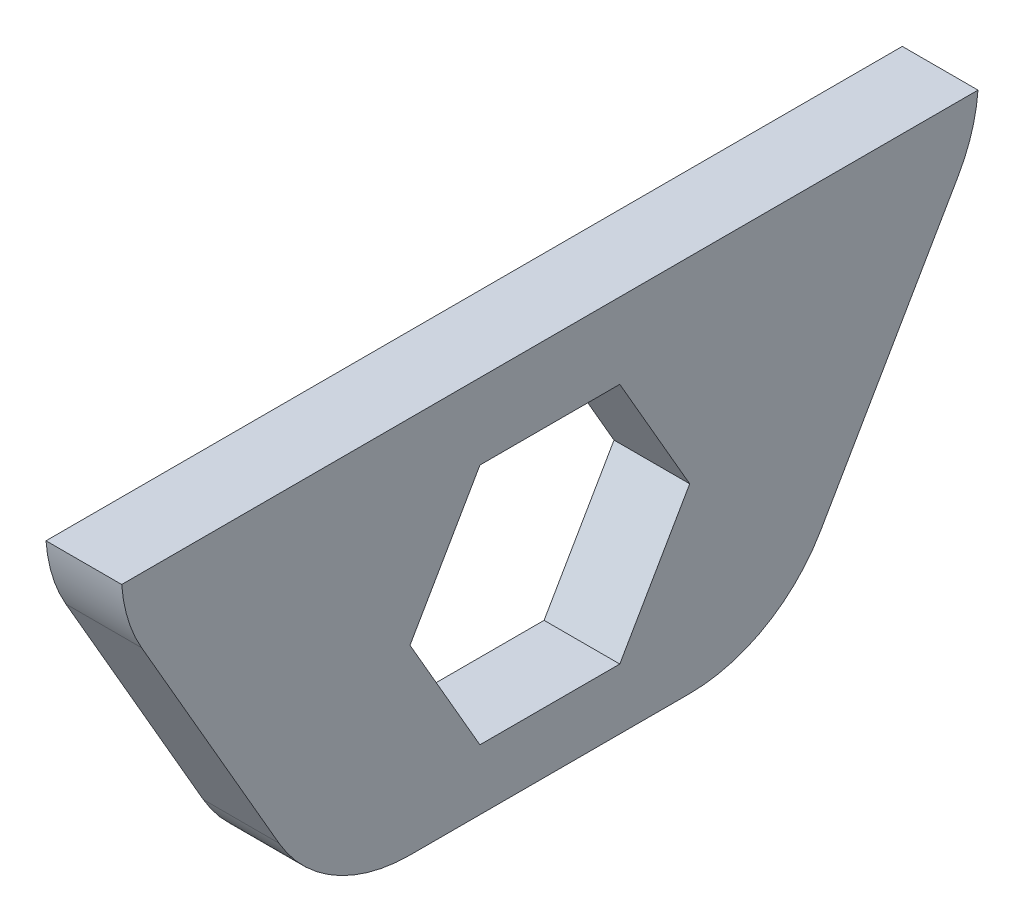
ISO-10303-21;
HEADER;
FILE_DESCRIPTION(('STEP AP214'),'2;1');
FILE_NAME('part.step','',(''),(''),'','','');
FILE_SCHEMA(('AUTOMOTIVE_DESIGN { 1 0 10303 214 1 1 1 1 }'));
ENDSEC;
DATA;
#1=APPLICATION_CONTEXT('core data for automotive mechanical design processes');
#2=APPLICATION_PROTOCOL_DEFINITION('international standard','automotive_design',2000,#1);
#3=PRODUCT_CONTEXT('',#1,'mechanical');
#4=PRODUCT('Part','Part','',(#3));
#5=PRODUCT_RELATED_PRODUCT_CATEGORY('part','',(#4));
#6=PRODUCT_DEFINITION_FORMATION('','',#4);
#7=PRODUCT_DEFINITION_CONTEXT('part definition',#1,'design');
#8=PRODUCT_DEFINITION('design','',#6,#7);
#9=PRODUCT_DEFINITION_SHAPE('','',#8);
#10=(LENGTH_UNIT() NAMED_UNIT(*) SI_UNIT(.MILLI.,.METRE.));
#11=(NAMED_UNIT(*) PLANE_ANGLE_UNIT() SI_UNIT($,.RADIAN.));
#12=(NAMED_UNIT(*) SI_UNIT($,.STERADIAN.) SOLID_ANGLE_UNIT());
#13=UNCERTAINTY_MEASURE_WITH_UNIT(LENGTH_MEASURE(1.E-05),#10,'distance_accuracy_value','');
#14=(GEOMETRIC_REPRESENTATION_CONTEXT(3) GLOBAL_UNCERTAINTY_ASSIGNED_CONTEXT((#13)) GLOBAL_UNIT_ASSIGNED_CONTEXT((#10,
#11,#12)) REPRESENTATION_CONTEXT('',''));
#15=CARTESIAN_POINT('',(0.,0.,0.));
#16=DIRECTION('',(0.,0.,1.));
#17=DIRECTION('',(1.,0.,0.));
#18=AXIS2_PLACEMENT_3D('',#15,#16,#17);
#19=CARTESIAN_POINT('',(5.,0.,-30.));
#20=DIRECTION('',(0.,1.,0.));
#21=DIRECTION('',(0.,0.,1.));
#22=AXIS2_PLACEMENT_3D('',#19,#20,#21);
#23=PLANE('',#22);
#24=DIRECTION('',(0.,0.,-1.));
#25=VECTOR('',#24,1.);
#26=CARTESIAN_POINT('',(0.,0.,-30.));
#27=LINE('',#26,#25);
#28=CARTESIAN_POINT('',(0.,0.,-5.77350269189627));
#29=VERTEX_POINT('',#28);
#30=CARTESIAN_POINT('',(0.,0.,-24.2264973081037));
#31=VERTEX_POINT('',#30);
#32=EDGE_CURVE('E170',#29,#31,#27,.T.);
#33=ORIENTED_EDGE('',*,*,#32,.T.);
#34=DIRECTION('',(-1.,0.,0.));
#35=VECTOR('',#34,1.);
#36=CARTESIAN_POINT('',(5.,0.,-24.2264973081037));
#37=LINE('',#36,#35);
#38=CARTESIAN_POINT('',(5.,0.,-24.2264973081037));
#39=VERTEX_POINT('',#38);
#40=EDGE_CURVE('E229',#31,#39,#37,.F.);
#41=ORIENTED_EDGE('',*,*,#40,.T.);
#42=DIRECTION('',(0.,0.,-1.));
#43=VECTOR('',#42,1.);
#44=CARTESIAN_POINT('',(5.,0.,-30.));
#45=LINE('',#44,#43);
#46=CARTESIAN_POINT('',(5.,0.,-5.77350269189627));
#47=VERTEX_POINT('',#46);
#48=EDGE_CURVE('E177',#47,#39,#45,.T.);
#49=ORIENTED_EDGE('',*,*,#48,.F.);
#50=DIRECTION('',(-1.,0.,0.));
#51=VECTOR('',#50,1.);
#52=CARTESIAN_POINT('',(5.,0.,-5.77350269189627));
#53=LINE('',#52,#51);
#54=EDGE_CURVE('E226',#47,#29,#53,.T.);
#55=ORIENTED_EDGE('',*,*,#54,.T.);
#56=EDGE_LOOP('',(#33,#41,#49,#55));
#57=FACE_BOUND('',#56,.T.);
#58=ADVANCED_FACE('F36',(#57),#23,.F.);
#59=CARTESIAN_POINT('',(5.,23.,-43.2790561913613));
#60=DIRECTION('',(0.,0.499999999999998,0.86602540378444));
#61=DIRECTION('',(0.,-0.86602540378444,0.499999999999998));
#62=AXIS2_PLACEMENT_3D('',#59,#60,#61);
#63=PLANE('',#62);
#64=DIRECTION('',(0.,0.86602540378444,-0.499999999999998));
#65=VECTOR('',#64,1.);
#66=CARTESIAN_POINT('',(0.,23.,-43.2790561913613));
#67=LINE('',#66,#65);
#68=CARTESIAN_POINT('',(0.,5.00000000000002,-32.8867513459481));
#69=VERTEX_POINT('',#68);
#70=CARTESIAN_POINT('',(0.,20.7250827823646,-41.9656321233754));
#71=VERTEX_POINT('',#70);
#72=EDGE_CURVE('E192',#69,#71,#67,.T.);
#73=ORIENTED_EDGE('',*,*,#72,.T.);
#74=DIRECTION('',(1.,0.,0.));
#75=VECTOR('',#74,1.);
#76=CARTESIAN_POINT('',(5.,20.7250827823646,-41.9656321233754));
#77=LINE('',#76,#75);
#78=CARTESIAN_POINT('',(5.,20.7250827823646,-41.9656321233754));
#79=VERTEX_POINT('',#78);
#80=EDGE_CURVE('E216',#71,#79,#77,.T.);
#81=ORIENTED_EDGE('',*,*,#80,.T.);
#82=DIRECTION('',(0.,0.86602540378444,-0.499999999999998));
#83=VECTOR('',#82,1.);
#84=CARTESIAN_POINT('',(5.,23.,-43.2790561913613));
#85=LINE('',#84,#83);
#86=CARTESIAN_POINT('',(5.,5.00000000000002,-32.8867513459481));
#87=VERTEX_POINT('',#86);
#88=EDGE_CURVE('E180',#87,#79,#85,.T.);
#89=ORIENTED_EDGE('',*,*,#88,.F.);
#90=DIRECTION('',(-1.,0.,0.));
#91=VECTOR('',#90,1.);
#92=CARTESIAN_POINT('',(5.,5.00000000000002,-32.8867513459481));
#93=LINE('',#92,#91);
#94=EDGE_CURVE('E213',#87,#69,#93,.T.);
#95=ORIENTED_EDGE('',*,*,#94,.T.);
#96=EDGE_LOOP('',(#73,#81,#89,#95));
#97=FACE_BOUND('',#96,.T.);
#98=ADVANCED_FACE('F271',(#97),#63,.F.);
#99=CARTESIAN_POINT('',(5.,25.,-43.2790561913613));
#100=DIRECTION('',(0.,-1.,0.));
#101=DIRECTION('',(0.,0.,-1.));
#102=AXIS2_PLACEMENT_3D('',#99,#100,#101);
#103=PLANE('',#102);
#104=DIRECTION('',(0.,0.,1.));
#105=VECTOR('',#104,1.);
#106=CARTESIAN_POINT('',(0.,25.,-43.2790561913613));
#107=LINE('',#106,#105);
#108=CARTESIAN_POINT('',(0.,25.,-43.2790561913613));
#109=VERTEX_POINT('',#108);
#110=CARTESIAN_POINT('',(0.,25.,13.2790561913613));
#111=VERTEX_POINT('',#110);
#112=EDGE_CURVE('E195',#109,#111,#107,.T.);
#113=ORIENTED_EDGE('',*,*,#112,.T.);
#114=DIRECTION('',(-1.,0.,0.));
#115=VECTOR('',#114,1.);
#116=CARTESIAN_POINT('',(5.,25.,13.2790561913613));
#117=LINE('',#116,#115);
#118=CARTESIAN_POINT('',(5.,25.,13.2790561913613));
#119=VERTEX_POINT('',#118);
#120=EDGE_CURVE('E189',#119,#111,#117,.T.);
#121=ORIENTED_EDGE('',*,*,#120,.F.);
#122=DIRECTION('',(0.,0.,1.));
#123=VECTOR('',#122,1.);
#124=CARTESIAN_POINT('',(5.,25.,-43.2790561913613));
#125=LINE('',#124,#123);
#126=CARTESIAN_POINT('',(5.,25.,-43.2790561913613));
#127=VERTEX_POINT('',#126);
#128=EDGE_CURVE('E184',#127,#119,#125,.T.);
#129=ORIENTED_EDGE('',*,*,#128,.F.);
#130=DIRECTION('',(-1.,0.,0.));
#131=VECTOR('',#130,1.);
#132=CARTESIAN_POINT('',(5.,25.,-43.2790561913613));
#133=LINE('',#132,#131);
#134=EDGE_CURVE('E202',#127,#109,#133,.T.);
#135=ORIENTED_EDGE('',*,*,#134,.T.);
#136=EDGE_LOOP('',(#113,#121,#129,#135));
#137=FACE_BOUND('',#136,.T.);
#138=ADVANCED_FACE('F277',(#137),#103,.F.);
#139=CARTESIAN_POINT('',(5.,0.,0.));
#140=DIRECTION('',(0.,0.499999999999998,-0.86602540378444));
#141=DIRECTION('',(0.,0.86602540378444,0.499999999999998));
#142=AXIS2_PLACEMENT_3D('',#139,#140,#141);
#143=PLANE('',#142);
#144=DIRECTION('',(0.,-0.86602540378444,-0.499999999999998));
#145=VECTOR('',#144,1.);
#146=CARTESIAN_POINT('',(0.,0.,0.));
#147=LINE('',#146,#145);
#148=CARTESIAN_POINT('',(0.,20.7250827823646,11.9656321233754));
#149=VERTEX_POINT('',#148);
#150=CARTESIAN_POINT('',(0.,5.00000000000002,2.88675134594812));
#151=VERTEX_POINT('',#150);
#152=EDGE_CURVE('E181',#149,#151,#147,.T.);
#153=ORIENTED_EDGE('',*,*,#152,.T.);
#154=DIRECTION('',(-1.,0.,0.));
#155=VECTOR('',#154,1.);
#156=CARTESIAN_POINT('',(5.,5.00000000000002,2.88675134594813));
#157=LINE('',#156,#155);
#158=CARTESIAN_POINT('',(5.,5.00000000000002,2.88675134594812));
#159=VERTEX_POINT('',#158);
#160=EDGE_CURVE('E234',#151,#159,#157,.F.);
#161=ORIENTED_EDGE('',*,*,#160,.T.);
#162=DIRECTION('',(0.,-0.86602540378444,-0.499999999999998));
#163=VECTOR('',#162,1.);
#164=CARTESIAN_POINT('',(5.,0.,0.));
#165=LINE('',#164,#163);
#166=CARTESIAN_POINT('',(5.,20.7250827823646,11.9656321233754));
#167=VERTEX_POINT('',#166);
#168=EDGE_CURVE('E186',#167,#159,#165,.T.);
#169=ORIENTED_EDGE('',*,*,#168,.F.);
#170=DIRECTION('',(-1.,0.,0.));
#171=VECTOR('',#170,1.);
#172=CARTESIAN_POINT('',(5.,20.7250827823646,11.9656321233754));
#173=LINE('',#172,#171);
#174=EDGE_CURVE('E231',#167,#149,#173,.T.);
#175=ORIENTED_EDGE('',*,*,#174,.T.);
#176=EDGE_LOOP('',(#153,#161,#169,#175));
#177=FACE_BOUND('',#176,.T.);
#178=ADVANCED_FACE('F314',(#177),#143,.F.);
#179=CARTESIAN_POINT('',(5.,0.,0.));
#180=DIRECTION('',(1.,0.,0.));
#181=DIRECTION('',(0.,0.,-1.));
#182=AXIS2_PLACEMENT_3D('',#179,#180,#181);
#183=PLANE('',#182);
#184=DIRECTION('',(0.,0.866025403784439,0.5));
#185=VECTOR('',#184,1.);
#186=CARTESIAN_POINT('',(5.,12.,-24.237604307034));
#187=LINE('',#186,#185);
#188=CARTESIAN_POINT('',(5.,12.,-24.237604307034));
#189=VERTEX_POINT('',#188);
#190=CARTESIAN_POINT('',(5.,20.,-19.618802153517));
#191=VERTEX_POINT('',#190);
#192=EDGE_CURVE('E51',#189,#191,#187,.T.);
#193=ORIENTED_EDGE('',*,*,#192,.F.);
#194=DIRECTION('',(0.,0.866025403784438,-0.5));
#195=VECTOR('',#194,1.);
#196=CARTESIAN_POINT('',(5.,4.,-19.618802153517));
#197=LINE('',#196,#195);
#198=CARTESIAN_POINT('',(5.,4.,-19.618802153517));
#199=VERTEX_POINT('',#198);
#200=EDGE_CURVE('E165',#199,#189,#197,.T.);
#201=ORIENTED_EDGE('',*,*,#200,.F.);
#202=DIRECTION('',(0.,0.,-1.));
#203=VECTOR('',#202,1.);
#204=CARTESIAN_POINT('',(5.,4.,-10.381197846483));
#205=LINE('',#204,#203);
#206=CARTESIAN_POINT('',(5.,4.,-10.381197846483));
#207=VERTEX_POINT('',#206);
#208=EDGE_CURVE('E159',#207,#199,#205,.T.);
#209=ORIENTED_EDGE('',*,*,#208,.F.);
#210=DIRECTION('',(0.,-0.866025403784439,-0.5));
#211=VECTOR('',#210,1.);
#212=CARTESIAN_POINT('',(5.,12.,-5.76239569296598));
#213=LINE('',#212,#211);
#214=CARTESIAN_POINT('',(5.,12.,-5.76239569296598));
#215=VERTEX_POINT('',#214);
#216=EDGE_CURVE('E157',#215,#207,#213,.T.);
#217=ORIENTED_EDGE('',*,*,#216,.F.);
#218=DIRECTION('',(0.,-0.866025403784439,0.5));
#219=VECTOR('',#218,1.);
#220=CARTESIAN_POINT('',(5.,20.,-10.381197846483));
#221=LINE('',#220,#219);
#222=CARTESIAN_POINT('',(5.,20.,-10.381197846483));
#223=VERTEX_POINT('',#222);
#224=EDGE_CURVE('E140',#223,#215,#221,.T.);
#225=ORIENTED_EDGE('',*,*,#224,.F.);
#226=DIRECTION('',(0.,0.,1.));
#227=VECTOR('',#226,1.);
#228=CARTESIAN_POINT('',(5.,20.,-19.618802153517));
#229=LINE('',#228,#227);
#230=EDGE_CURVE('E149',#191,#223,#229,.T.);
#231=ORIENTED_EDGE('',*,*,#230,.F.);
#232=EDGE_LOOP('',(#193,#201,#209,#217,#225,#231));
#233=FACE_BOUND('',#232,.T.);
#234=ORIENTED_EDGE('',*,*,#88,.T.);
#235=CARTESIAN_POINT('',(5.,25.7250827823646,-33.305378085531));
#236=DIRECTION('',(1.,0.,0.));
#237=DIRECTION('',(0.,0.,-1.));
#238=AXIS2_PLACEMENT_3D('',#235,#236,#237);
#239=CIRCLE('',#238,10.);
#240=EDGE_CURVE('E224',#79,#127,#239,.T.);
#241=ORIENTED_EDGE('',*,*,#240,.T.);
#242=ORIENTED_EDGE('',*,*,#128,.T.);
#243=CARTESIAN_POINT('',(5.,25.7250827823646,3.30537808553104));
#244=DIRECTION('',(1.,0.,0.));
#245=DIRECTION('',(0.,0.,-1.));
#246=AXIS2_PLACEMENT_3D('',#243,#244,#245);
#247=CIRCLE('',#246,10.);
#248=EDGE_CURVE('E218',#119,#167,#247,.T.);
#249=ORIENTED_EDGE('',*,*,#248,.T.);
#250=ORIENTED_EDGE('',*,*,#168,.T.);
#251=CARTESIAN_POINT('',(5.,10.,-5.77350269189627));
#252=DIRECTION('',(1.,0.,0.));
#253=DIRECTION('',(0.,0.,-1.));
#254=AXIS2_PLACEMENT_3D('',#251,#252,#253);
#255=CIRCLE('',#254,10.);
#256=EDGE_CURVE('E220',#159,#47,#255,.T.);
#257=ORIENTED_EDGE('',*,*,#256,.T.);
#258=ORIENTED_EDGE('',*,*,#48,.T.);
#259=CARTESIAN_POINT('',(5.,10.,-24.2264973081037));
#260=DIRECTION('',(1.,0.,0.));
#261=DIRECTION('',(0.,0.,-1.));
#262=AXIS2_PLACEMENT_3D('',#259,#260,#261);
#263=CIRCLE('',#262,10.);
#264=EDGE_CURVE('E222',#39,#87,#263,.T.);
#265=ORIENTED_EDGE('',*,*,#264,.T.);
#266=EDGE_LOOP('',(#234,#241,#242,#249,#250,#257,#258,#265));
#267=FACE_BOUND('',#266,.T.);
#268=ADVANCED_FACE('F153',(#233,#267),#183,.T.);
#269=CARTESIAN_POINT('',(0.,0.,0.));
#270=DIRECTION('',(1.,0.,0.));
#271=DIRECTION('',(0.,0.,-1.));
#272=AXIS2_PLACEMENT_3D('',#269,#270,#271);
#273=PLANE('',#272);
#274=DIRECTION('',(0.,0.866025403784438,-0.5));
#275=VECTOR('',#274,1.);
#276=CARTESIAN_POINT('',(0.,-7.49519052838329,-12.9820508075689));
#277=LINE('',#276,#275);
#278=CARTESIAN_POINT('',(0.,4.,-19.618802153517));
#279=VERTEX_POINT('',#278);
#280=CARTESIAN_POINT('',(0.,12.,-24.237604307034));
#281=VERTEX_POINT('',#280);
#282=EDGE_CURVE('E44',#279,#281,#277,.T.);
#283=ORIENTED_EDGE('',*,*,#282,.T.);
#284=DIRECTION('',(0.,0.866025403784439,0.5));
#285=VECTOR('',#284,1.);
#286=CARTESIAN_POINT('',(0.,13.4951905283833,-23.3743556529821));
#287=LINE('',#286,#285);
#288=CARTESIAN_POINT('',(0.,20.,-19.618802153517));
#289=VERTEX_POINT('',#288);
#290=EDGE_CURVE('E11',#281,#289,#287,.T.);
#291=ORIENTED_EDGE('',*,*,#290,.T.);
#292=DIRECTION('',(0.,0.,1.));
#293=VECTOR('',#292,1.);
#294=CARTESIAN_POINT('',(0.,20.,0.));
#295=LINE('',#294,#293);
#296=CARTESIAN_POINT('',(0.,20.,-10.381197846483));
#297=VERTEX_POINT('',#296);
#298=EDGE_CURVE('E236',#289,#297,#295,.T.);
#299=ORIENTED_EDGE('',*,*,#298,.T.);
#300=DIRECTION('',(0.,-0.866025403784439,0.5));
#301=VECTOR('',#300,1.);
#302=CARTESIAN_POINT('',(0.,0.504809471616711,0.874355652982143));
#303=LINE('',#302,#301);
#304=CARTESIAN_POINT('',(0.,12.,-5.76239569296598));
#305=VERTEX_POINT('',#304);
#306=EDGE_CURVE('E143',#297,#305,#303,.T.);
#307=ORIENTED_EDGE('',*,*,#306,.T.);
#308=DIRECTION('',(0.,-0.866025403784439,-0.5));
#309=VECTOR('',#308,1.);
#310=CARTESIAN_POINT('',(0.,5.49519052838329,-9.51794919243112));
#311=LINE('',#310,#309);
#312=CARTESIAN_POINT('',(0.,4.,-10.381197846483));
#313=VERTEX_POINT('',#312);
#314=EDGE_CURVE('E239',#305,#313,#311,.T.);
#315=ORIENTED_EDGE('',*,*,#314,.T.);
#316=DIRECTION('',(0.,0.,-1.));
#317=VECTOR('',#316,1.);
#318=CARTESIAN_POINT('',(0.,4.,0.));
#319=LINE('',#318,#317);
#320=EDGE_CURVE('E242',#313,#279,#319,.T.);
#321=ORIENTED_EDGE('',*,*,#320,.T.);
#322=EDGE_LOOP('',(#283,#291,#299,#307,#315,#321));
#323=FACE_BOUND('',#322,.T.);
#324=ORIENTED_EDGE('',*,*,#112,.F.);
#325=CARTESIAN_POINT('',(0.,25.7250827823646,-33.305378085531));
#326=DIRECTION('',(1.,0.,0.));
#327=DIRECTION('',(0.,0.,-1.));
#328=AXIS2_PLACEMENT_3D('',#325,#326,#327);
#329=CIRCLE('',#328,10.);
#330=EDGE_CURVE('E211',#109,#71,#329,.F.);
#331=ORIENTED_EDGE('',*,*,#330,.T.);
#332=ORIENTED_EDGE('',*,*,#72,.F.);
#333=CARTESIAN_POINT('',(0.,10.,-24.2264973081037));
#334=DIRECTION('',(1.,0.,0.));
#335=DIRECTION('',(0.,0.,-1.));
#336=AXIS2_PLACEMENT_3D('',#333,#334,#335);
#337=CIRCLE('',#336,10.);
#338=EDGE_CURVE('E209',#69,#31,#337,.F.);
#339=ORIENTED_EDGE('',*,*,#338,.T.);
#340=ORIENTED_EDGE('',*,*,#32,.F.);
#341=CARTESIAN_POINT('',(0.,10.,-5.77350269189627));
#342=DIRECTION('',(1.,0.,0.));
#343=DIRECTION('',(0.,0.,-1.));
#344=AXIS2_PLACEMENT_3D('',#341,#342,#343);
#345=CIRCLE('',#344,10.);
#346=EDGE_CURVE('E207',#29,#151,#345,.F.);
#347=ORIENTED_EDGE('',*,*,#346,.T.);
#348=ORIENTED_EDGE('',*,*,#152,.F.);
#349=CARTESIAN_POINT('',(0.,25.7250827823646,3.30537808553104));
#350=DIRECTION('',(1.,0.,0.));
#351=DIRECTION('',(0.,0.,-1.));
#352=AXIS2_PLACEMENT_3D('',#349,#350,#351);
#353=CIRCLE('',#352,10.);
#354=EDGE_CURVE('E205',#149,#111,#353,.F.);
#355=ORIENTED_EDGE('',*,*,#354,.T.);
#356=EDGE_LOOP('',(#324,#331,#332,#339,#340,#347,#348,#355));
#357=FACE_BOUND('',#356,.T.);
#358=ADVANCED_FACE('F246',(#323,#357),#273,.F.);
#359=CARTESIAN_POINT('',(5.,25.7250827823646,-33.305378085531));
#360=DIRECTION('',(1.,0.,0.));
#361=DIRECTION('',(0.,0.,-1.));
#362=AXIS2_PLACEMENT_3D('',#359,#360,#361);
#363=CYLINDRICAL_SURFACE('',#362,10.);
#364=ORIENTED_EDGE('',*,*,#240,.F.);
#365=ORIENTED_EDGE('',*,*,#80,.F.);
#366=ORIENTED_EDGE('',*,*,#330,.F.);
#367=ORIENTED_EDGE('',*,*,#134,.F.);
#368=EDGE_LOOP('',(#364,#365,#366,#367));
#369=FACE_BOUND('',#368,.T.);
#370=ADVANCED_FACE('F282',(#369),#363,.T.);
#371=CARTESIAN_POINT('',(5.,10.,-24.2264973081037));
#372=DIRECTION('',(-1.,0.,0.));
#373=DIRECTION('',(0.,0.,1.));
#374=AXIS2_PLACEMENT_3D('',#371,#372,#373);
#375=CYLINDRICAL_SURFACE('',#374,10.);
#376=ORIENTED_EDGE('',*,*,#264,.F.);
#377=ORIENTED_EDGE('',*,*,#40,.F.);
#378=ORIENTED_EDGE('',*,*,#338,.F.);
#379=ORIENTED_EDGE('',*,*,#94,.F.);
#380=EDGE_LOOP('',(#376,#377,#378,#379));
#381=FACE_BOUND('',#380,.T.);
#382=ADVANCED_FACE('F285',(#381),#375,.T.);
#383=CARTESIAN_POINT('',(5.,10.,-5.77350269189627));
#384=DIRECTION('',(-1.,0.,0.));
#385=DIRECTION('',(0.,0.,1.));
#386=AXIS2_PLACEMENT_3D('',#383,#384,#385);
#387=CYLINDRICAL_SURFACE('',#386,10.);
#388=ORIENTED_EDGE('',*,*,#256,.F.);
#389=ORIENTED_EDGE('',*,*,#160,.F.);
#390=ORIENTED_EDGE('',*,*,#346,.F.);
#391=ORIENTED_EDGE('',*,*,#54,.F.);
#392=EDGE_LOOP('',(#388,#389,#390,#391));
#393=FACE_BOUND('',#392,.T.);
#394=ADVANCED_FACE('F266',(#393),#387,.T.);
#395=CARTESIAN_POINT('',(5.,25.7250827823646,3.30537808553104));
#396=DIRECTION('',(-1.,0.,0.));
#397=DIRECTION('',(0.,0.,1.));
#398=AXIS2_PLACEMENT_3D('',#395,#396,#397);
#399=CYLINDRICAL_SURFACE('',#398,10.);
#400=ORIENTED_EDGE('',*,*,#248,.F.);
#401=ORIENTED_EDGE('',*,*,#120,.T.);
#402=ORIENTED_EDGE('',*,*,#354,.F.);
#403=ORIENTED_EDGE('',*,*,#174,.F.);
#404=EDGE_LOOP('',(#400,#401,#402,#403));
#405=FACE_BOUND('',#404,.T.);
#406=ADVANCED_FACE('F38',(#405),#399,.T.);
#407=CARTESIAN_POINT('',(-5.,12.,-24.237604307034));
#408=DIRECTION('',(0.,0.5,-0.866025403784438));
#409=DIRECTION('',(0.,0.866025403784439,0.5));
#410=AXIS2_PLACEMENT_3D('',#407,#408,#409);
#411=PLANE('',#410);
#412=DIRECTION('',(1.,0.,0.));
#413=VECTOR('',#412,1.);
#414=CARTESIAN_POINT('',(-5.,12.,-24.237604307034));
#415=LINE('',#414,#413);
#416=EDGE_CURVE('E168',#281,#189,#415,.T.);
#417=ORIENTED_EDGE('',*,*,#416,.T.);
#418=ORIENTED_EDGE('',*,*,#192,.T.);
#419=DIRECTION('',(1.,0.,0.));
#420=VECTOR('',#419,1.);
#421=CARTESIAN_POINT('',(-5.,20.,-19.618802153517));
#422=LINE('',#421,#420);
#423=EDGE_CURVE('E146',#289,#191,#422,.T.);
#424=ORIENTED_EDGE('',*,*,#423,.F.);
#425=ORIENTED_EDGE('',*,*,#290,.F.);
#426=EDGE_LOOP('',(#417,#418,#424,#425));
#427=FACE_BOUND('',#426,.T.);
#428=ADVANCED_FACE('F258',(#427),#411,.F.);
#429=CARTESIAN_POINT('',(-5.,4.,-19.618802153517));
#430=DIRECTION('',(0.,-0.5,-0.866025403784438));
#431=DIRECTION('',(0.,0.866025403784438,-0.5));
#432=AXIS2_PLACEMENT_3D('',#429,#430,#431);
#433=PLANE('',#432);
#434=DIRECTION('',(1.,0.,0.));
#435=VECTOR('',#434,1.);
#436=CARTESIAN_POINT('',(-5.,4.,-19.618802153517));
#437=LINE('',#436,#435);
#438=EDGE_CURVE('E171',#279,#199,#437,.T.);
#439=ORIENTED_EDGE('',*,*,#438,.T.);
#440=ORIENTED_EDGE('',*,*,#200,.T.);
#441=ORIENTED_EDGE('',*,*,#416,.F.);
#442=ORIENTED_EDGE('',*,*,#282,.F.);
#443=EDGE_LOOP('',(#439,#440,#441,#442));
#444=FACE_BOUND('',#443,.T.);
#445=ADVANCED_FACE('F251',(#444),#433,.F.);
#446=CARTESIAN_POINT('',(-5.,4.,-10.381197846483));
#447=DIRECTION('',(0.,-1.,0.));
#448=DIRECTION('',(0.,0.,-1.));
#449=AXIS2_PLACEMENT_3D('',#446,#447,#448);
#450=PLANE('',#449);
#451=DIRECTION('',(1.,0.,0.));
#452=VECTOR('',#451,1.);
#453=CARTESIAN_POINT('',(-5.,4.,-10.381197846483));
#454=LINE('',#453,#452);
#455=EDGE_CURVE('E173',#313,#207,#454,.T.);
#456=ORIENTED_EDGE('',*,*,#455,.T.);
#457=ORIENTED_EDGE('',*,*,#208,.T.);
#458=ORIENTED_EDGE('',*,*,#438,.F.);
#459=ORIENTED_EDGE('',*,*,#320,.F.);
#460=EDGE_LOOP('',(#456,#457,#458,#459));
#461=FACE_BOUND('',#460,.T.);
#462=ADVANCED_FACE('F253',(#461),#450,.F.);
#463=CARTESIAN_POINT('',(-5.,12.,-5.76239569296598));
#464=DIRECTION('',(0.,-0.5,0.866025403784439));
#465=DIRECTION('',(0.,-0.866025403784439,-0.5));
#466=AXIS2_PLACEMENT_3D('',#463,#464,#465);
#467=PLANE('',#466);
#468=DIRECTION('',(1.,0.,0.));
#469=VECTOR('',#468,1.);
#470=CARTESIAN_POINT('',(-5.,12.,-5.76239569296598));
#471=LINE('',#470,#469);
#472=EDGE_CURVE('E145',#305,#215,#471,.T.);
#473=ORIENTED_EDGE('',*,*,#472,.T.);
#474=ORIENTED_EDGE('',*,*,#216,.T.);
#475=ORIENTED_EDGE('',*,*,#455,.F.);
#476=ORIENTED_EDGE('',*,*,#314,.F.);
#477=EDGE_LOOP('',(#473,#474,#475,#476));
#478=FACE_BOUND('',#477,.T.);
#479=ADVANCED_FACE('F257',(#478),#467,.F.);
#480=CARTESIAN_POINT('',(-5.,20.,-10.381197846483));
#481=DIRECTION('',(0.,0.5,0.866025403784439));
#482=DIRECTION('',(0.,-0.866025403784439,0.5));
#483=AXIS2_PLACEMENT_3D('',#480,#481,#482);
#484=PLANE('',#483);
#485=DIRECTION('',(1.,0.,0.));
#486=VECTOR('',#485,1.);
#487=CARTESIAN_POINT('',(-5.,20.,-10.381197846483));
#488=LINE('',#487,#486);
#489=EDGE_CURVE('E59',#297,#223,#488,.T.);
#490=ORIENTED_EDGE('',*,*,#489,.T.);
#491=ORIENTED_EDGE('',*,*,#224,.T.);
#492=ORIENTED_EDGE('',*,*,#472,.F.);
#493=ORIENTED_EDGE('',*,*,#306,.F.);
#494=EDGE_LOOP('',(#490,#491,#492,#493));
#495=FACE_BOUND('',#494,.T.);
#496=ADVANCED_FACE('F137',(#495),#484,.F.);
#497=CARTESIAN_POINT('',(-5.,20.,-19.618802153517));
#498=DIRECTION('',(0.,1.,0.));
#499=DIRECTION('',(0.,0.,1.));
#500=AXIS2_PLACEMENT_3D('',#497,#498,#499);
#501=PLANE('',#500);
#502=ORIENTED_EDGE('',*,*,#423,.T.);
#503=ORIENTED_EDGE('',*,*,#230,.T.);
#504=ORIENTED_EDGE('',*,*,#489,.F.);
#505=ORIENTED_EDGE('',*,*,#298,.F.);
#506=EDGE_LOOP('',(#502,#503,#504,#505));
#507=FACE_BOUND('',#506,.T.);
#508=ADVANCED_FACE('F150',(#507),#501,.F.);
#509=CLOSED_SHELL('',(#58,#98,#138,#178,#268,#358,#370,#382,#394,#406,#428,#445,#462,#479,#496,#508));
#510=MANIFOLD_SOLID_BREP('B2',#509);
#511=ADVANCED_BREP_SHAPE_REPRESENTATION('',(#18,#510),#14);
#512=SHAPE_DEFINITION_REPRESENTATION(#9,#511);
ENDSEC;
END-ISO-10303-21;
